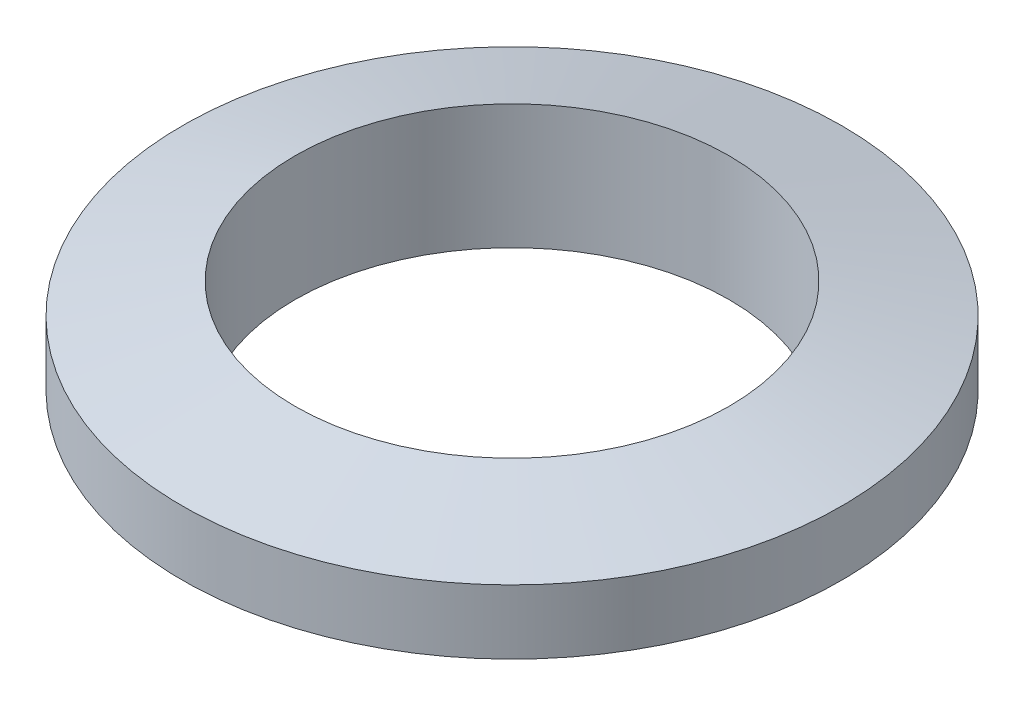
ISO-10303-21;
HEADER;
FILE_DESCRIPTION(('STEP AP214'),'2;1');
FILE_NAME('part.step','',(''),(''),'','','');
FILE_SCHEMA(('AUTOMOTIVE_DESIGN { 1 0 10303 214 1 1 1 1 }'));
ENDSEC;
DATA;
#1=APPLICATION_CONTEXT('core data for automotive mechanical design processes');
#2=APPLICATION_PROTOCOL_DEFINITION('international standard','automotive_design',2000,#1);
#3=PRODUCT_CONTEXT('',#1,'mechanical');
#4=PRODUCT('Part','Part','',(#3));
#5=PRODUCT_RELATED_PRODUCT_CATEGORY('part','',(#4));
#6=PRODUCT_DEFINITION_FORMATION('','',#4);
#7=PRODUCT_DEFINITION_CONTEXT('part definition',#1,'design');
#8=PRODUCT_DEFINITION('design','',#6,#7);
#9=PRODUCT_DEFINITION_SHAPE('','',#8);
#10=(LENGTH_UNIT() NAMED_UNIT(*) SI_UNIT(.MILLI.,.METRE.));
#11=(NAMED_UNIT(*) PLANE_ANGLE_UNIT() SI_UNIT($,.RADIAN.));
#12=(NAMED_UNIT(*) SI_UNIT($,.STERADIAN.) SOLID_ANGLE_UNIT());
#13=UNCERTAINTY_MEASURE_WITH_UNIT(LENGTH_MEASURE(1.E-05),#10,'distance_accuracy_value','');
#14=(GEOMETRIC_REPRESENTATION_CONTEXT(3) GLOBAL_UNCERTAINTY_ASSIGNED_CONTEXT((#13)) GLOBAL_UNIT_ASSIGNED_CONTEXT((#10,
#11,#12)) REPRESENTATION_CONTEXT('',''));
#15=CARTESIAN_POINT('',(0.,0.,0.));
#16=DIRECTION('',(0.,0.,1.));
#17=DIRECTION('',(1.,0.,0.));
#18=AXIS2_PLACEMENT_3D('',#15,#16,#17);
#19=CARTESIAN_POINT('',(0.,-2.,0.));
#20=DIRECTION('',(0.,1.,0.));
#21=DIRECTION('',(0.,0.,1.));
#22=AXIS2_PLACEMENT_3D('',#19,#20,#21);
#23=CONICAL_SURFACE('',#22,20.5,1.30899693899575);
#24=CARTESIAN_POINT('',(0.,-3.87564434701786,0.));
#25=DIRECTION('',(0.,-1.,0.));
#26=DIRECTION('',(0.,0.,-1.));
#27=AXIS2_PLACEMENT_3D('',#24,#25,#26);
#28=CIRCLE('',#27,13.5);
#29=CARTESIAN_POINT('',(0.,-3.87564434701786,-13.5));
#30=VERTEX_POINT('',#29);
#31=EDGE_CURVE('E51',#30,#30,#28,.T.);
#32=ORIENTED_EDGE('',*,*,#31,.F.);
#33=EDGE_LOOP('',(#32));
#34=FACE_BOUND('',#33,.T.);
#35=CARTESIAN_POINT('',(0.,-2.,0.));
#36=DIRECTION('',(0.,-1.,0.));
#37=DIRECTION('',(0.,0.,-1.));
#38=AXIS2_PLACEMENT_3D('',#35,#36,#37);
#39=CIRCLE('',#38,20.5);
#40=CARTESIAN_POINT('',(0.,-2.,-20.5));
#41=VERTEX_POINT('',#40);
#42=EDGE_CURVE('E10',#41,#41,#39,.T.);
#43=ORIENTED_EDGE('',*,*,#42,.T.);
#44=EDGE_LOOP('',(#43));
#45=FACE_BOUND('',#44,.T.);
#46=ADVANCED_FACE('F37',(#34,#45),#23,.T.);
#47=CARTESIAN_POINT('',(0.,0.,0.));
#48=DIRECTION('',(0.,-1.,0.));
#49=DIRECTION('',(0.,0.,-1.));
#50=AXIS2_PLACEMENT_3D('',#47,#48,#49);
#51=CYLINDRICAL_SURFACE('',#50,20.5);
#52=ORIENTED_EDGE('',*,*,#42,.F.);
#53=EDGE_LOOP('',(#52));
#54=FACE_BOUND('',#53,.T.);
#55=CARTESIAN_POINT('',(0.,2.,0.));
#56=DIRECTION('',(0.,-1.,0.));
#57=DIRECTION('',(0.,0.,-1.));
#58=AXIS2_PLACEMENT_3D('',#55,#56,#57);
#59=CIRCLE('',#58,20.5);
#60=CARTESIAN_POINT('',(0.,2.,-20.5));
#61=VERTEX_POINT('',#60);
#62=EDGE_CURVE('E43',#61,#61,#59,.T.);
#63=ORIENTED_EDGE('',*,*,#62,.T.);
#64=EDGE_LOOP('',(#63));
#65=FACE_BOUND('',#64,.T.);
#66=ADVANCED_FACE('F60',(#54,#65),#51,.T.);
#67=CARTESIAN_POINT('',(0.,3.87564434701786,0.));
#68=DIRECTION('',(0.,-1.,0.));
#69=DIRECTION('',(0.,0.,-1.));
#70=AXIS2_PLACEMENT_3D('',#67,#68,#69);
#71=CONICAL_SURFACE('',#70,13.5,1.30899693899575);
#72=ORIENTED_EDGE('',*,*,#62,.F.);
#73=EDGE_LOOP('',(#72));
#74=FACE_BOUND('',#73,.T.);
#75=CARTESIAN_POINT('',(0.,3.87564434701786,0.));
#76=DIRECTION('',(0.,-1.,0.));
#77=DIRECTION('',(0.,0.,-1.));
#78=AXIS2_PLACEMENT_3D('',#75,#76,#77);
#79=CIRCLE('',#78,13.5);
#80=CARTESIAN_POINT('',(0.,3.87564434701786,-13.5));
#81=VERTEX_POINT('',#80);
#82=EDGE_CURVE('E47',#81,#81,#79,.T.);
#83=ORIENTED_EDGE('',*,*,#82,.T.);
#84=EDGE_LOOP('',(#83));
#85=FACE_BOUND('',#84,.T.);
#86=ADVANCED_FACE('F64',(#74,#85),#71,.T.);
#87=CARTESIAN_POINT('',(0.,0.,0.));
#88=DIRECTION('',(0.,-1.,0.));
#89=DIRECTION('',(0.,0.,-1.));
#90=AXIS2_PLACEMENT_3D('',#87,#88,#89);
#91=CYLINDRICAL_SURFACE('',#90,13.5);
#92=ORIENTED_EDGE('',*,*,#82,.F.);
#93=EDGE_LOOP('',(#92));
#94=FACE_BOUND('',#93,.T.);
#95=ORIENTED_EDGE('',*,*,#31,.T.);
#96=EDGE_LOOP('',(#95));
#97=FACE_BOUND('',#96,.T.);
#98=ADVANCED_FACE('F57',(#94,#97),#91,.F.);
#99=CLOSED_SHELL('',(#46,#66,#86,#98));
#100=MANIFOLD_SOLID_BREP('B2',#99);
#101=ADVANCED_BREP_SHAPE_REPRESENTATION('',(#18,#100),#14);
#102=SHAPE_DEFINITION_REPRESENTATION(#9,#101);
ENDSEC;
END-ISO-10303-21;
